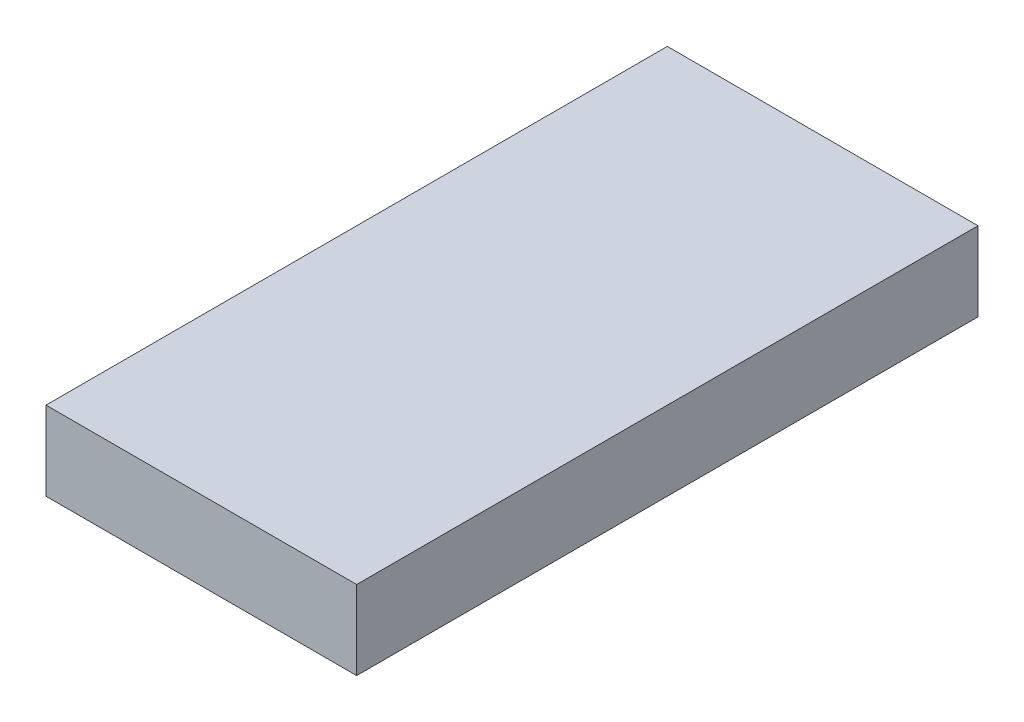
ISO-10303-21;
HEADER;
FILE_DESCRIPTION(('STEP AP214'),'2;1');
FILE_NAME('part.step','',(''),(''),'','','');
FILE_SCHEMA(('AUTOMOTIVE_DESIGN { 1 0 10303 214 1 1 1 1 }'));
ENDSEC;
DATA;
#1=APPLICATION_CONTEXT('core data for automotive mechanical design processes');
#2=APPLICATION_PROTOCOL_DEFINITION('international standard','automotive_design',2000,#1);
#3=PRODUCT_CONTEXT('',#1,'mechanical');
#4=PRODUCT('Part','Part','',(#3));
#5=PRODUCT_RELATED_PRODUCT_CATEGORY('part','',(#4));
#6=PRODUCT_DEFINITION_FORMATION('','',#4);
#7=PRODUCT_DEFINITION_CONTEXT('part definition',#1,'design');
#8=PRODUCT_DEFINITION('design','',#6,#7);
#9=PRODUCT_DEFINITION_SHAPE('','',#8);
#10=(LENGTH_UNIT() NAMED_UNIT(*) SI_UNIT(.MILLI.,.METRE.));
#11=(NAMED_UNIT(*) PLANE_ANGLE_UNIT() SI_UNIT($,.RADIAN.));
#12=(NAMED_UNIT(*) SI_UNIT($,.STERADIAN.) SOLID_ANGLE_UNIT());
#13=UNCERTAINTY_MEASURE_WITH_UNIT(LENGTH_MEASURE(1.E-05),#10,'distance_accuracy_value','');
#14=(GEOMETRIC_REPRESENTATION_CONTEXT(3) GLOBAL_UNCERTAINTY_ASSIGNED_CONTEXT((#13)) GLOBAL_UNIT_ASSIGNED_CONTEXT((#10,
#11,#12)) REPRESENTATION_CONTEXT('',''));
#15=CARTESIAN_POINT('',(0.,0.,0.));
#16=DIRECTION('',(0.,0.,1.));
#17=DIRECTION('',(1.,0.,0.));
#18=AXIS2_PLACEMENT_3D('',#15,#16,#17);
#19=CARTESIAN_POINT('',(0.,6.35,0.));
#20=DIRECTION('',(1.,0.,0.));
#21=DIRECTION('',(0.,0.,-1.));
#22=AXIS2_PLACEMENT_3D('',#19,#20,#21);
#23=PLANE('',#22);
#24=DIRECTION('',(0.,0.,1.));
#25=VECTOR('',#24,1.);
#26=CARTESIAN_POINT('',(0.,0.,0.));
#27=LINE('',#26,#25);
#28=CARTESIAN_POINT('',(0.,0.,0.));
#29=VERTEX_POINT('',#28);
#30=CARTESIAN_POINT('',(0.,0.,50.));
#31=VERTEX_POINT('',#30);
#32=EDGE_CURVE('E104',#29,#31,#27,.T.);
#33=ORIENTED_EDGE('',*,*,#32,.T.);
#34=DIRECTION('',(0.,-1.,0.));
#35=VECTOR('',#34,1.);
#36=CARTESIAN_POINT('',(0.,6.35,50.));
#37=LINE('',#36,#35);
#38=CARTESIAN_POINT('',(0.,6.35,50.));
#39=VERTEX_POINT('',#38);
#40=EDGE_CURVE('E11',#39,#31,#37,.T.);
#41=ORIENTED_EDGE('',*,*,#40,.F.);
#42=DIRECTION('',(0.,0.,1.));
#43=VECTOR('',#42,1.);
#44=CARTESIAN_POINT('',(0.,6.35,0.));
#45=LINE('',#44,#43);
#46=CARTESIAN_POINT('',(0.,6.35,0.));
#47=VERTEX_POINT('',#46);
#48=EDGE_CURVE('E92',#47,#39,#45,.T.);
#49=ORIENTED_EDGE('',*,*,#48,.F.);
#50=DIRECTION('',(0.,-1.,0.));
#51=VECTOR('',#50,1.);
#52=CARTESIAN_POINT('',(0.,6.35,0.));
#53=LINE('',#52,#51);
#54=EDGE_CURVE('E100',#47,#29,#53,.T.);
#55=ORIENTED_EDGE('',*,*,#54,.T.);
#56=EDGE_LOOP('',(#33,#41,#49,#55));
#57=FACE_BOUND('',#56,.T.);
#58=ADVANCED_FACE('F41',(#57),#23,.F.);
#59=CARTESIAN_POINT('',(0.,6.35,50.));
#60=DIRECTION('',(0.,0.,-1.));
#61=DIRECTION('',(-1.,0.,0.));
#62=AXIS2_PLACEMENT_3D('',#59,#60,#61);
#63=PLANE('',#62);
#64=DIRECTION('',(1.,0.,0.));
#65=VECTOR('',#64,1.);
#66=CARTESIAN_POINT('',(0.,0.,50.));
#67=LINE('',#66,#65);
#68=CARTESIAN_POINT('',(25.,0.,50.));
#69=VERTEX_POINT('',#68);
#70=EDGE_CURVE('E96',#31,#69,#67,.T.);
#71=ORIENTED_EDGE('',*,*,#70,.T.);
#72=DIRECTION('',(0.,-1.,0.));
#73=VECTOR('',#72,1.);
#74=CARTESIAN_POINT('',(25.,6.35,50.));
#75=LINE('',#74,#73);
#76=CARTESIAN_POINT('',(25.,6.35,50.));
#77=VERTEX_POINT('',#76);
#78=EDGE_CURVE('E49',#77,#69,#75,.T.);
#79=ORIENTED_EDGE('',*,*,#78,.F.);
#80=DIRECTION('',(1.,0.,0.));
#81=VECTOR('',#80,1.);
#82=CARTESIAN_POINT('',(0.,6.35,50.));
#83=LINE('',#82,#81);
#84=EDGE_CURVE('E87',#39,#77,#83,.T.);
#85=ORIENTED_EDGE('',*,*,#84,.F.);
#86=ORIENTED_EDGE('',*,*,#40,.T.);
#87=EDGE_LOOP('',(#71,#79,#85,#86));
#88=FACE_BOUND('',#87,.T.);
#89=ADVANCED_FACE('F95',(#88),#63,.F.);
#90=CARTESIAN_POINT('',(25.,6.35,0.));
#91=DIRECTION('',(-1.,0.,0.));
#92=DIRECTION('',(0.,0.,1.));
#93=AXIS2_PLACEMENT_3D('',#90,#91,#92);
#94=PLANE('',#93);
#95=DIRECTION('',(0.,0.,-1.));
#96=VECTOR('',#95,1.);
#97=CARTESIAN_POINT('',(25.,0.,0.));
#98=LINE('',#97,#96);
#99=CARTESIAN_POINT('',(25.,0.,0.));
#100=VERTEX_POINT('',#99);
#101=EDGE_CURVE('E74',#69,#100,#98,.T.);
#102=ORIENTED_EDGE('',*,*,#101,.T.);
#103=DIRECTION('',(0.,-1.,0.));
#104=VECTOR('',#103,1.);
#105=CARTESIAN_POINT('',(25.,6.35,0.));
#106=LINE('',#105,#104);
#107=CARTESIAN_POINT('',(25.,6.35,0.));
#108=VERTEX_POINT('',#107);
#109=EDGE_CURVE('E97',#108,#100,#106,.T.);
#110=ORIENTED_EDGE('',*,*,#109,.F.);
#111=DIRECTION('',(0.,0.,-1.));
#112=VECTOR('',#111,1.);
#113=CARTESIAN_POINT('',(25.,6.35,0.));
#114=LINE('',#113,#112);
#115=EDGE_CURVE('E90',#77,#108,#114,.T.);
#116=ORIENTED_EDGE('',*,*,#115,.F.);
#117=ORIENTED_EDGE('',*,*,#78,.T.);
#118=EDGE_LOOP('',(#102,#110,#116,#117));
#119=FACE_BOUND('',#118,.T.);
#120=ADVANCED_FACE('F98',(#119),#94,.F.);
#121=CARTESIAN_POINT('',(0.,6.35,0.));
#122=DIRECTION('',(0.,0.,1.));
#123=DIRECTION('',(1.,0.,0.));
#124=AXIS2_PLACEMENT_3D('',#121,#122,#123);
#125=PLANE('',#124);
#126=DIRECTION('',(-1.,0.,0.));
#127=VECTOR('',#126,1.);
#128=CARTESIAN_POINT('',(0.,0.,0.));
#129=LINE('',#128,#127);
#130=EDGE_CURVE('E80',#100,#29,#129,.T.);
#131=ORIENTED_EDGE('',*,*,#130,.T.);
#132=ORIENTED_EDGE('',*,*,#54,.F.);
#133=DIRECTION('',(-1.,0.,0.));
#134=VECTOR('',#133,1.);
#135=CARTESIAN_POINT('',(0.,6.35,0.));
#136=LINE('',#135,#134);
#137=EDGE_CURVE('E57',#108,#47,#136,.T.);
#138=ORIENTED_EDGE('',*,*,#137,.F.);
#139=ORIENTED_EDGE('',*,*,#109,.T.);
#140=EDGE_LOOP('',(#131,#132,#138,#139));
#141=FACE_BOUND('',#140,.T.);
#142=ADVANCED_FACE('F111',(#141),#125,.F.);
#143=CARTESIAN_POINT('',(0.,6.35,0.));
#144=DIRECTION('',(0.,1.,0.));
#145=DIRECTION('',(0.,0.,1.));
#146=AXIS2_PLACEMENT_3D('',#143,#144,#145);
#147=PLANE('',#146);
#148=ORIENTED_EDGE('',*,*,#48,.T.);
#149=ORIENTED_EDGE('',*,*,#84,.T.);
#150=ORIENTED_EDGE('',*,*,#115,.T.);
#151=ORIENTED_EDGE('',*,*,#137,.T.);
#152=EDGE_LOOP('',(#148,#149,#150,#151));
#153=FACE_BOUND('',#152,.T.);
#154=ADVANCED_FACE('F88',(#153),#147,.T.);
#155=CARTESIAN_POINT('',(0.,0.,0.));
#156=DIRECTION('',(0.,1.,0.));
#157=DIRECTION('',(0.,0.,1.));
#158=AXIS2_PLACEMENT_3D('',#155,#156,#157);
#159=PLANE('',#158);
#160=ORIENTED_EDGE('',*,*,#32,.F.);
#161=ORIENTED_EDGE('',*,*,#130,.F.);
#162=ORIENTED_EDGE('',*,*,#101,.F.);
#163=ORIENTED_EDGE('',*,*,#70,.F.);
#164=EDGE_LOOP('',(#160,#161,#162,#163));
#165=FACE_BOUND('',#164,.T.);
#166=ADVANCED_FACE('F114',(#165),#159,.F.);
#167=CLOSED_SHELL('',(#58,#89,#120,#142,#154,#166));
#168=MANIFOLD_SOLID_BREP('B2',#167);
#169=ADVANCED_BREP_SHAPE_REPRESENTATION('',(#18,#168),#14);
#170=SHAPE_DEFINITION_REPRESENTATION(#9,#169);
ENDSEC;
END-ISO-10303-21;
